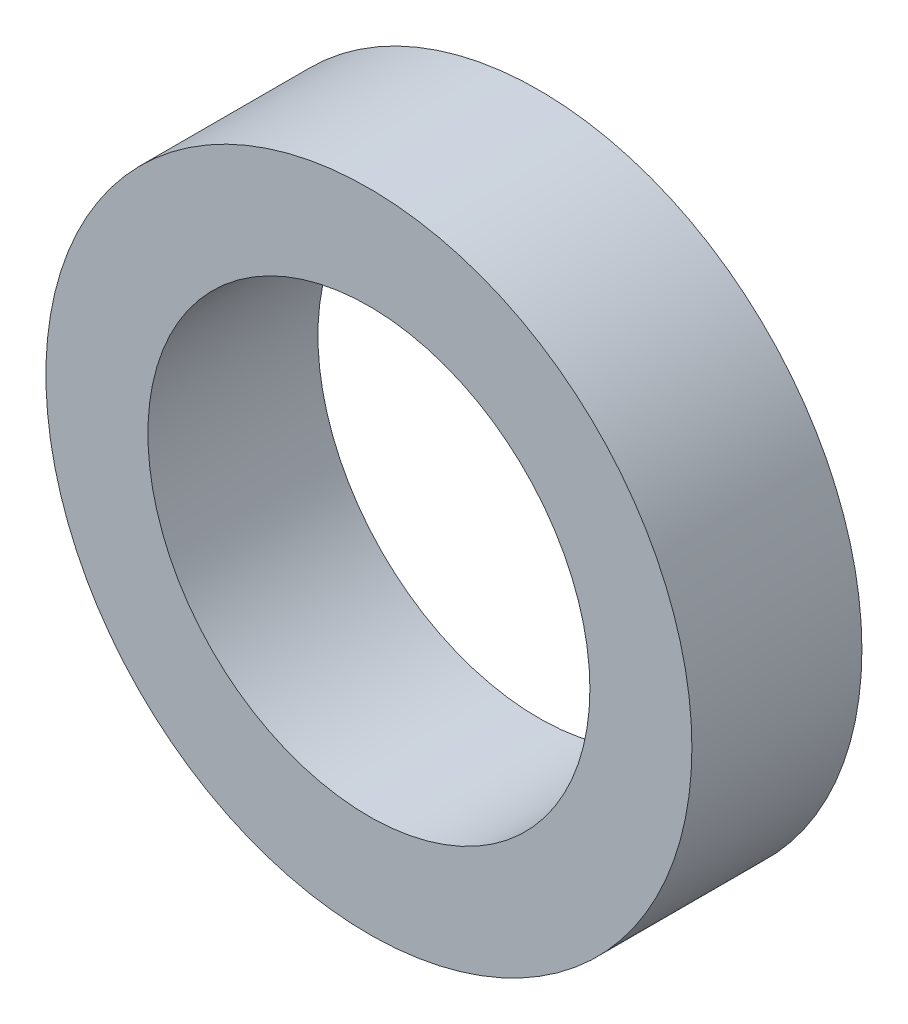
ISO-10303-21;
HEADER;
FILE_DESCRIPTION(('STEP AP214'),'2;1');
FILE_NAME('part.step','',(''),(''),'','','');
FILE_SCHEMA(('AUTOMOTIVE_DESIGN { 1 0 10303 214 1 1 1 1 }'));
ENDSEC;
DATA;
#1=APPLICATION_CONTEXT('core data for automotive mechanical design processes');
#2=APPLICATION_PROTOCOL_DEFINITION('international standard','automotive_design',2000,#1);
#3=PRODUCT_CONTEXT('',#1,'mechanical');
#4=PRODUCT('Part','Part','',(#3));
#5=PRODUCT_RELATED_PRODUCT_CATEGORY('part','',(#4));
#6=PRODUCT_DEFINITION_FORMATION('','',#4);
#7=PRODUCT_DEFINITION_CONTEXT('part definition',#1,'design');
#8=PRODUCT_DEFINITION('design','',#6,#7);
#9=PRODUCT_DEFINITION_SHAPE('','',#8);
#10=(LENGTH_UNIT() NAMED_UNIT(*) SI_UNIT(.MILLI.,.METRE.));
#11=(NAMED_UNIT(*) PLANE_ANGLE_UNIT() SI_UNIT($,.RADIAN.));
#12=(NAMED_UNIT(*) SI_UNIT($,.STERADIAN.) SOLID_ANGLE_UNIT());
#13=UNCERTAINTY_MEASURE_WITH_UNIT(LENGTH_MEASURE(1.E-05),#10,'distance_accuracy_value','');
#14=(GEOMETRIC_REPRESENTATION_CONTEXT(3) GLOBAL_UNCERTAINTY_ASSIGNED_CONTEXT((#13)) GLOBAL_UNIT_ASSIGNED_CONTEXT((#10,
#11,#12)) REPRESENTATION_CONTEXT('',''));
#15=CARTESIAN_POINT('',(0.,0.,0.));
#16=DIRECTION('',(0.,0.,1.));
#17=DIRECTION('',(1.,0.,0.));
#18=AXIS2_PLACEMENT_3D('',#15,#16,#17);
#19=CARTESIAN_POINT('',(0.,0.,2.5));
#20=DIRECTION('',(0.,0.,1.));
#21=DIRECTION('',(1.,0.,0.));
#22=AXIS2_PLACEMENT_3D('',#19,#20,#21);
#23=PLANE('',#22);
#24=CARTESIAN_POINT('',(0.,0.,2.5));
#25=DIRECTION('',(0.,0.,1.));
#26=DIRECTION('',(1.,0.,0.));
#27=AXIS2_PLACEMENT_3D('',#24,#25,#26);
#28=CIRCLE('',#27,9.5);
#29=CARTESIAN_POINT('',(9.5,0.,2.5));
#30=VERTEX_POINT('',#29);
#31=EDGE_CURVE('E10',#30,#30,#28,.T.);
#32=ORIENTED_EDGE('',*,*,#31,.T.);
#33=EDGE_LOOP('',(#32));
#34=FACE_BOUND('',#33,.T.);
#35=CARTESIAN_POINT('',(0.,0.,2.5));
#36=DIRECTION('',(0.,0.,1.));
#37=DIRECTION('',(1.,0.,0.));
#38=AXIS2_PLACEMENT_3D('',#35,#36,#37);
#39=CIRCLE('',#38,6.5);
#40=CARTESIAN_POINT('',(6.5,0.,2.5));
#41=VERTEX_POINT('',#40);
#42=EDGE_CURVE('E42',#41,#41,#39,.T.);
#43=ORIENTED_EDGE('',*,*,#42,.F.);
#44=EDGE_LOOP('',(#43));
#45=FACE_BOUND('',#44,.T.);
#46=ADVANCED_FACE('F31',(#34,#45),#23,.T.);
#47=CARTESIAN_POINT('',(0.,0.,-2.5));
#48=DIRECTION('',(0.,0.,1.));
#49=DIRECTION('',(1.,0.,0.));
#50=AXIS2_PLACEMENT_3D('',#47,#48,#49);
#51=PLANE('',#50);
#52=CARTESIAN_POINT('',(0.,0.,-2.5));
#53=DIRECTION('',(0.,0.,1.));
#54=DIRECTION('',(1.,0.,0.));
#55=AXIS2_PLACEMENT_3D('',#52,#53,#54);
#56=CIRCLE('',#55,9.5);
#57=CARTESIAN_POINT('',(9.5,0.,-2.5));
#58=VERTEX_POINT('',#57);
#59=EDGE_CURVE('E35',#58,#58,#56,.T.);
#60=ORIENTED_EDGE('',*,*,#59,.F.);
#61=EDGE_LOOP('',(#60));
#62=FACE_BOUND('',#61,.T.);
#63=CARTESIAN_POINT('',(0.,0.,-2.5));
#64=DIRECTION('',(0.,0.,1.));
#65=DIRECTION('',(1.,0.,0.));
#66=AXIS2_PLACEMENT_3D('',#63,#64,#65);
#67=CIRCLE('',#66,6.5);
#68=CARTESIAN_POINT('',(6.5,0.,-2.5));
#69=VERTEX_POINT('',#68);
#70=EDGE_CURVE('E44',#69,#69,#67,.T.);
#71=ORIENTED_EDGE('',*,*,#70,.T.);
#72=EDGE_LOOP('',(#71));
#73=FACE_BOUND('',#72,.T.);
#74=ADVANCED_FACE('F54',(#62,#73),#51,.F.);
#75=CARTESIAN_POINT('',(0.,0.,2.5));
#76=DIRECTION('',(0.,0.,-1.));
#77=DIRECTION('',(-1.,0.,0.));
#78=AXIS2_PLACEMENT_3D('',#75,#76,#77);
#79=CYLINDRICAL_SURFACE('',#78,9.5);
#80=ORIENTED_EDGE('',*,*,#31,.F.);
#81=EDGE_LOOP('',(#80));
#82=FACE_BOUND('',#81,.T.);
#83=ORIENTED_EDGE('',*,*,#59,.T.);
#84=EDGE_LOOP('',(#83));
#85=FACE_BOUND('',#84,.T.);
#86=ADVANCED_FACE('F33',(#82,#85),#79,.T.);
#87=CARTESIAN_POINT('',(0.,0.,2.5));
#88=DIRECTION('',(0.,0.,-1.));
#89=DIRECTION('',(-1.,0.,0.));
#90=AXIS2_PLACEMENT_3D('',#87,#88,#89);
#91=CYLINDRICAL_SURFACE('',#90,6.5);
#92=ORIENTED_EDGE('',*,*,#42,.T.);
#93=EDGE_LOOP('',(#92));
#94=FACE_BOUND('',#93,.T.);
#95=ORIENTED_EDGE('',*,*,#70,.F.);
#96=EDGE_LOOP('',(#95));
#97=FACE_BOUND('',#96,.T.);
#98=ADVANCED_FACE('F50',(#94,#97),#91,.F.);
#99=CLOSED_SHELL('',(#46,#74,#86,#98));
#100=MANIFOLD_SOLID_BREP('B2',#99);
#101=ADVANCED_BREP_SHAPE_REPRESENTATION('',(#18,#100),#14);
#102=SHAPE_DEFINITION_REPRESENTATION(#9,#101);
ENDSEC;
END-ISO-10303-21;
